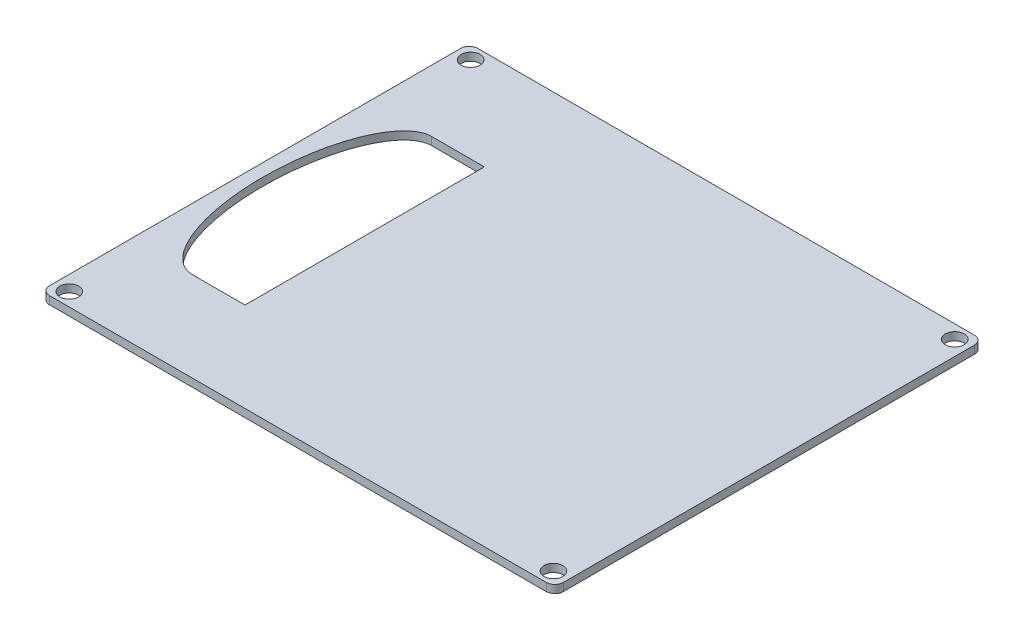
ISO-10303-21;
HEADER;
FILE_DESCRIPTION(('STEP AP214'),'2;1');
FILE_NAME('part.step','',(''),(''),'','','');
FILE_SCHEMA(('AUTOMOTIVE_DESIGN { 1 0 10303 214 1 1 1 1 }'));
ENDSEC;
DATA;
#1=APPLICATION_CONTEXT('core data for automotive mechanical design processes');
#2=APPLICATION_PROTOCOL_DEFINITION('international standard','automotive_design',2000,#1);
#3=PRODUCT_CONTEXT('',#1,'mechanical');
#4=PRODUCT('Part','Part','',(#3));
#5=PRODUCT_RELATED_PRODUCT_CATEGORY('part','',(#4));
#6=PRODUCT_DEFINITION_FORMATION('','',#4);
#7=PRODUCT_DEFINITION_CONTEXT('part definition',#1,'design');
#8=PRODUCT_DEFINITION('design','',#6,#7);
#9=PRODUCT_DEFINITION_SHAPE('','',#8);
#10=(LENGTH_UNIT() NAMED_UNIT(*) SI_UNIT(.MILLI.,.METRE.));
#11=(NAMED_UNIT(*) PLANE_ANGLE_UNIT() SI_UNIT($,.RADIAN.));
#12=(NAMED_UNIT(*) SI_UNIT($,.STERADIAN.) SOLID_ANGLE_UNIT());
#13=UNCERTAINTY_MEASURE_WITH_UNIT(LENGTH_MEASURE(1.E-05),#10,'distance_accuracy_value','');
#14=(GEOMETRIC_REPRESENTATION_CONTEXT(3) GLOBAL_UNCERTAINTY_ASSIGNED_CONTEXT((#13)) GLOBAL_UNIT_ASSIGNED_CONTEXT((#10,
#11,#12)) REPRESENTATION_CONTEXT('',''));
#15=CARTESIAN_POINT('',(0.,0.,0.));
#16=DIRECTION('',(0.,0.,1.));
#17=DIRECTION('',(1.,0.,0.));
#18=AXIS2_PLACEMENT_3D('',#15,#16,#17);
#19=CARTESIAN_POINT('',(76.2,2.3622,-63.5));
#20=DIRECTION('',(-1.,0.,0.));
#21=DIRECTION('',(0.,0.,1.));
#22=AXIS2_PLACEMENT_3D('',#19,#20,#21);
#23=PLANE('',#22);
#24=DIRECTION('',(0.,0.,-1.));
#25=VECTOR('',#24,1.);
#26=CARTESIAN_POINT('',(76.2,2.3622,-63.5));
#27=LINE('',#26,#25);
#28=CARTESIAN_POINT('',(76.2,2.3622,60.96));
#29=VERTEX_POINT('',#28);
#30=CARTESIAN_POINT('',(76.2,2.3622,-60.96));
#31=VERTEX_POINT('',#30);
#32=EDGE_CURVE('E183',#29,#31,#27,.T.);
#33=ORIENTED_EDGE('',*,*,#32,.F.);
#34=DIRECTION('',(0.,-1.,0.));
#35=VECTOR('',#34,1.);
#36=CARTESIAN_POINT('',(76.2,2.3622,60.96));
#37=LINE('',#36,#35);
#38=CARTESIAN_POINT('',(76.2,0.,60.96));
#39=VERTEX_POINT('',#38);
#40=EDGE_CURVE('E234',#29,#39,#37,.T.);
#41=ORIENTED_EDGE('',*,*,#40,.T.);
#42=DIRECTION('',(0.,0.,-1.));
#43=VECTOR('',#42,1.);
#44=CARTESIAN_POINT('',(76.2,0.,-63.5));
#45=LINE('',#44,#43);
#46=CARTESIAN_POINT('',(76.2,0.,-60.96));
#47=VERTEX_POINT('',#46);
#48=EDGE_CURVE('E180',#39,#47,#45,.T.);
#49=ORIENTED_EDGE('',*,*,#48,.T.);
#50=DIRECTION('',(0.,-1.,0.));
#51=VECTOR('',#50,1.);
#52=CARTESIAN_POINT('',(76.2,2.3622,-60.96));
#53=LINE('',#52,#51);
#54=EDGE_CURVE('E232',#47,#31,#53,.F.);
#55=ORIENTED_EDGE('',*,*,#54,.T.);
#56=EDGE_LOOP('',(#33,#41,#49,#55));
#57=FACE_BOUND('',#56,.T.);
#58=ADVANCED_FACE('F35',(#57),#23,.F.);
#59=CARTESIAN_POINT('',(-76.2,2.3622,-63.5));
#60=DIRECTION('',(0.,0.,1.));
#61=DIRECTION('',(1.,0.,0.));
#62=AXIS2_PLACEMENT_3D('',#59,#60,#61);
#63=PLANE('',#62);
#64=DIRECTION('',(-1.,0.,0.));
#65=VECTOR('',#64,1.);
#66=CARTESIAN_POINT('',(-76.2,2.3622,-63.5));
#67=LINE('',#66,#65);
#68=CARTESIAN_POINT('',(73.66,2.3622,-63.5));
#69=VERTEX_POINT('',#68);
#70=CARTESIAN_POINT('',(-73.66,2.3622,-63.5));
#71=VERTEX_POINT('',#70);
#72=EDGE_CURVE('E186',#69,#71,#67,.T.);
#73=ORIENTED_EDGE('',*,*,#72,.F.);
#74=DIRECTION('',(0.,-1.,0.));
#75=VECTOR('',#74,1.);
#76=CARTESIAN_POINT('',(73.66,2.3622,-63.5));
#77=LINE('',#76,#75);
#78=CARTESIAN_POINT('',(73.66,0.,-63.5));
#79=VERTEX_POINT('',#78);
#80=EDGE_CURVE('E12',#69,#79,#77,.T.);
#81=ORIENTED_EDGE('',*,*,#80,.T.);
#82=DIRECTION('',(-1.,0.,0.));
#83=VECTOR('',#82,1.);
#84=CARTESIAN_POINT('',(-76.2,0.,-63.5));
#85=LINE('',#84,#83);
#86=CARTESIAN_POINT('',(-73.66,0.,-63.5));
#87=VERTEX_POINT('',#86);
#88=EDGE_CURVE('E199',#79,#87,#85,.T.);
#89=ORIENTED_EDGE('',*,*,#88,.T.);
#90=DIRECTION('',(0.,-1.,0.));
#91=VECTOR('',#90,1.);
#92=CARTESIAN_POINT('',(-73.66,2.3622,-63.5));
#93=LINE('',#92,#91);
#94=EDGE_CURVE('E43',#87,#71,#93,.F.);
#95=ORIENTED_EDGE('',*,*,#94,.T.);
#96=EDGE_LOOP('',(#73,#81,#89,#95));
#97=FACE_BOUND('',#96,.T.);
#98=ADVANCED_FACE('F239',(#97),#63,.F.);
#99=CARTESIAN_POINT('',(-76.2,2.3622,-63.5));
#100=DIRECTION('',(1.,0.,0.));
#101=DIRECTION('',(0.,0.,-1.));
#102=AXIS2_PLACEMENT_3D('',#99,#100,#101);
#103=PLANE('',#102);
#104=DIRECTION('',(0.,0.,1.));
#105=VECTOR('',#104,1.);
#106=CARTESIAN_POINT('',(-76.2,0.,-63.5));
#107=LINE('',#106,#105);
#108=CARTESIAN_POINT('',(-76.2,0.,-60.96));
#109=VERTEX_POINT('',#108);
#110=CARTESIAN_POINT('',(-76.2,0.,60.96));
#111=VERTEX_POINT('',#110);
#112=EDGE_CURVE('E202',#109,#111,#107,.T.);
#113=ORIENTED_EDGE('',*,*,#112,.T.);
#114=DIRECTION('',(0.,-1.,0.));
#115=VECTOR('',#114,1.);
#116=CARTESIAN_POINT('',(-76.2,2.3622,60.96));
#117=LINE('',#116,#115);
#118=CARTESIAN_POINT('',(-76.2,2.3622,60.96));
#119=VERTEX_POINT('',#118);
#120=EDGE_CURVE('E222',#111,#119,#117,.F.);
#121=ORIENTED_EDGE('',*,*,#120,.T.);
#122=DIRECTION('',(0.,0.,1.));
#123=VECTOR('',#122,1.);
#124=CARTESIAN_POINT('',(-76.2,2.3622,-63.5));
#125=LINE('',#124,#123);
#126=CARTESIAN_POINT('',(-76.2,2.3622,-60.96));
#127=VERTEX_POINT('',#126);
#128=EDGE_CURVE('E190',#127,#119,#125,.T.);
#129=ORIENTED_EDGE('',*,*,#128,.F.);
#130=DIRECTION('',(0.,-1.,0.));
#131=VECTOR('',#130,1.);
#132=CARTESIAN_POINT('',(-76.2,2.3622,-60.96));
#133=LINE('',#132,#131);
#134=EDGE_CURVE('E219',#127,#109,#133,.T.);
#135=ORIENTED_EDGE('',*,*,#134,.T.);
#136=EDGE_LOOP('',(#113,#121,#129,#135));
#137=FACE_BOUND('',#136,.T.);
#138=ADVANCED_FACE('F250',(#137),#103,.F.);
#139=CARTESIAN_POINT('',(-76.2,2.3622,63.5));
#140=DIRECTION('',(0.,0.,-1.));
#141=DIRECTION('',(-1.,0.,0.));
#142=AXIS2_PLACEMENT_3D('',#139,#140,#141);
#143=PLANE('',#142);
#144=DIRECTION('',(1.,0.,0.));
#145=VECTOR('',#144,1.);
#146=CARTESIAN_POINT('',(-76.2,2.3622,63.5));
#147=LINE('',#146,#145);
#148=CARTESIAN_POINT('',(-73.66,2.3622,63.5));
#149=VERTEX_POINT('',#148);
#150=CARTESIAN_POINT('',(73.66,2.3622,63.5));
#151=VERTEX_POINT('',#150);
#152=EDGE_CURVE('E193',#149,#151,#147,.T.);
#153=ORIENTED_EDGE('',*,*,#152,.F.);
#154=DIRECTION('',(0.,-1.,0.));
#155=VECTOR('',#154,1.);
#156=CARTESIAN_POINT('',(-73.66,2.3622,63.5));
#157=LINE('',#156,#155);
#158=CARTESIAN_POINT('',(-73.66,0.,63.5));
#159=VERTEX_POINT('',#158);
#160=EDGE_CURVE('E208',#149,#159,#157,.T.);
#161=ORIENTED_EDGE('',*,*,#160,.T.);
#162=DIRECTION('',(1.,0.,0.));
#163=VECTOR('',#162,1.);
#164=CARTESIAN_POINT('',(-76.2,0.,63.5));
#165=LINE('',#164,#163);
#166=CARTESIAN_POINT('',(73.66,0.,63.5));
#167=VERTEX_POINT('',#166);
#168=EDGE_CURVE('E187',#159,#167,#165,.T.);
#169=ORIENTED_EDGE('',*,*,#168,.T.);
#170=DIRECTION('',(0.,-1.,0.));
#171=VECTOR('',#170,1.);
#172=CARTESIAN_POINT('',(73.66,2.3622,63.5));
#173=LINE('',#172,#171);
#174=EDGE_CURVE('E196',#167,#151,#173,.F.);
#175=ORIENTED_EDGE('',*,*,#174,.T.);
#176=EDGE_LOOP('',(#153,#161,#169,#175));
#177=FACE_BOUND('',#176,.T.);
#178=ADVANCED_FACE('F261',(#177),#143,.F.);
#179=CARTESIAN_POINT('',(0.,2.3622,0.));
#180=DIRECTION('',(0.,1.,0.));
#181=DIRECTION('',(0.,0.,1.));
#182=AXIS2_PLACEMENT_3D('',#179,#180,#181);
#183=PLANE('',#182);
#184=CARTESIAN_POINT('',(-57.8578913926201,2.3622,1.44007365035895));
#185=DIRECTION('',(0.,1.,0.));
#186=DIRECTION('',(0.,0.,1.));
#187=AXIS2_PLACEMENT_3D('',#184,#185,#186);
#188=ELLIPSE('',#187,35.4844500063675,14.605);
#189=CARTESIAN_POINT('',(-57.8578913926201,2.3622,-34.0443763560085));
#190=VERTEX_POINT('',#189);
#191=CARTESIAN_POINT('',(-57.8578913926201,2.3622,36.9245236567264));
#192=VERTEX_POINT('',#191);
#193=EDGE_CURVE('E50',#190,#192,#188,.T.);
#194=ORIENTED_EDGE('',*,*,#193,.F.);
#195=DIRECTION('',(-1.,0.,0.));
#196=VECTOR('',#195,1.);
#197=CARTESIAN_POINT('',(-57.8578913926201,2.3622,-34.0443763560085));
#198=LINE('',#197,#196);
#199=CARTESIAN_POINT('',(-42.2579164672201,2.3622,-34.0443763560085));
#200=VERTEX_POINT('',#199);
#201=EDGE_CURVE('E139',#200,#190,#198,.T.);
#202=ORIENTED_EDGE('',*,*,#201,.F.);
#203=DIRECTION('',(0.,0.,-1.));
#204=VECTOR('',#203,1.);
#205=CARTESIAN_POINT('',(-42.2579164672201,2.3622,-34.0443763560085));
#206=LINE('',#205,#204);
#207=CARTESIAN_POINT('',(-42.2579164672201,2.3622,36.9245236567264));
#208=VERTEX_POINT('',#207);
#209=EDGE_CURVE('E146',#208,#200,#206,.T.);
#210=ORIENTED_EDGE('',*,*,#209,.F.);
#211=DIRECTION('',(1.,0.,0.));
#212=VECTOR('',#211,1.);
#213=CARTESIAN_POINT('',(-57.8578913926201,2.3622,36.9245236567264));
#214=LINE('',#213,#212);
#215=EDGE_CURVE('E141',#192,#208,#214,.T.);
#216=ORIENTED_EDGE('',*,*,#215,.F.);
#217=EDGE_LOOP('',(#194,#202,#210,#216));
#218=FACE_BOUND('',#217,.T.);
#219=CARTESIAN_POINT('',(-71.7948137847569,2.3622,-59.5104358344753));
#220=DIRECTION('',(0.,-1.,0.));
#221=DIRECTION('',(0.,0.,1.));
#222=AXIS2_PLACEMENT_3D('',#219,#220,#221);
#223=CIRCLE('',#222,2.79400000031772);
#224=CARTESIAN_POINT('',(-71.7948137847569,2.3622,-56.7164358341575));
#225=VERTEX_POINT('',#224);
#226=EDGE_CURVE('E130',#225,#225,#223,.T.);
#227=ORIENTED_EDGE('',*,*,#226,.T.);
#228=EDGE_LOOP('',(#227));
#229=FACE_BOUND('',#228,.T.);
#230=CARTESIAN_POINT('',(-71.794813784757,2.3622,59.5104358344751));
#231=DIRECTION('',(0.,-1.,0.));
#232=DIRECTION('',(0.,0.,1.));
#233=AXIS2_PLACEMENT_3D('',#230,#231,#232);
#234=CIRCLE('',#233,2.79400000031772);
#235=CARTESIAN_POINT('',(-71.794813784757,2.3622,62.3044358347929));
#236=VERTEX_POINT('',#235);
#237=EDGE_CURVE('E162',#236,#236,#234,.T.);
#238=ORIENTED_EDGE('',*,*,#237,.T.);
#239=EDGE_LOOP('',(#238));
#240=FACE_BOUND('',#239,.T.);
#241=CARTESIAN_POINT('',(71.7948137847569,2.3622,-59.5104358344753));
#242=DIRECTION('',(0.,1.,0.));
#243=DIRECTION('',(0.,0.,1.));
#244=AXIS2_PLACEMENT_3D('',#241,#242,#243);
#245=CIRCLE('',#244,2.79400000031772);
#246=CARTESIAN_POINT('',(71.7948137847569,2.3622,-56.7164358341575));
#247=VERTEX_POINT('',#246);
#248=EDGE_CURVE('E168',#247,#247,#245,.T.);
#249=ORIENTED_EDGE('',*,*,#248,.F.);
#250=EDGE_LOOP('',(#249));
#251=FACE_BOUND('',#250,.T.);
#252=CARTESIAN_POINT('',(71.794813784757,2.3622,59.5104358344751));
#253=DIRECTION('',(0.,1.,0.));
#254=DIRECTION('',(0.,0.,1.));
#255=AXIS2_PLACEMENT_3D('',#252,#253,#254);
#256=CIRCLE('',#255,2.79400000031772);
#257=CARTESIAN_POINT('',(71.794813784757,2.3622,62.3044358347929));
#258=VERTEX_POINT('',#257);
#259=EDGE_CURVE('E174',#258,#258,#256,.T.);
#260=ORIENTED_EDGE('',*,*,#259,.F.);
#261=EDGE_LOOP('',(#260));
#262=FACE_BOUND('',#261,.T.);
#263=ORIENTED_EDGE('',*,*,#128,.T.);
#264=CARTESIAN_POINT('',(-73.66,2.3622,60.96));
#265=DIRECTION('',(0.,1.,0.));
#266=DIRECTION('',(0.,0.,1.));
#267=AXIS2_PLACEMENT_3D('',#264,#265,#266);
#268=CIRCLE('',#267,2.54);
#269=EDGE_CURVE('E230',#119,#149,#268,.T.);
#270=ORIENTED_EDGE('',*,*,#269,.T.);
#271=ORIENTED_EDGE('',*,*,#152,.T.);
#272=CARTESIAN_POINT('',(73.66,2.3622,60.96));
#273=DIRECTION('',(0.,1.,0.));
#274=DIRECTION('',(0.,0.,1.));
#275=AXIS2_PLACEMENT_3D('',#272,#273,#274);
#276=CIRCLE('',#275,2.54);
#277=EDGE_CURVE('E228',#151,#29,#276,.T.);
#278=ORIENTED_EDGE('',*,*,#277,.T.);
#279=ORIENTED_EDGE('',*,*,#32,.T.);
#280=CARTESIAN_POINT('',(73.66,2.3622,-60.96));
#281=DIRECTION('',(0.,1.,0.));
#282=DIRECTION('',(0.,0.,1.));
#283=AXIS2_PLACEMENT_3D('',#280,#281,#282);
#284=CIRCLE('',#283,2.54);
#285=EDGE_CURVE('E226',#31,#69,#284,.T.);
#286=ORIENTED_EDGE('',*,*,#285,.T.);
#287=ORIENTED_EDGE('',*,*,#72,.T.);
#288=CARTESIAN_POINT('',(-73.66,2.3622,-60.96));
#289=DIRECTION('',(0.,1.,0.));
#290=DIRECTION('',(0.,0.,1.));
#291=AXIS2_PLACEMENT_3D('',#288,#289,#290);
#292=CIRCLE('',#291,2.54);
#293=EDGE_CURVE('E224',#71,#127,#292,.T.);
#294=ORIENTED_EDGE('',*,*,#293,.T.);
#295=EDGE_LOOP('',(#263,#270,#271,#278,#279,#286,#287,#294));
#296=FACE_BOUND('',#295,.T.);
#297=ADVANCED_FACE('F136',(#218,#229,#240,#251,#262,#296),#183,.T.);
#298=CARTESIAN_POINT('',(0.,0.,0.));
#299=DIRECTION('',(0.,1.,0.));
#300=DIRECTION('',(0.,0.,1.));
#301=AXIS2_PLACEMENT_3D('',#298,#299,#300);
#302=PLANE('',#301);
#303=DIRECTION('',(-1.,0.,0.));
#304=VECTOR('',#303,1.);
#305=CARTESIAN_POINT('',(-57.8578913926201,0.,-34.0443763560085));
#306=LINE('',#305,#304);
#307=CARTESIAN_POINT('',(-42.2579164672201,0.,-34.0443763560085));
#308=VERTEX_POINT('',#307);
#309=CARTESIAN_POINT('',(-57.8578913926201,0.,-34.0443763560085));
#310=VERTEX_POINT('',#309);
#311=EDGE_CURVE('E158',#308,#310,#306,.T.);
#312=ORIENTED_EDGE('',*,*,#311,.T.);
#313=CARTESIAN_POINT('',(-57.8578913926201,0.,1.44007365035895));
#314=DIRECTION('',(0.,1.,0.));
#315=DIRECTION('',(0.,0.,1.));
#316=AXIS2_PLACEMENT_3D('',#313,#314,#315);
#317=ELLIPSE('',#316,35.4844500063675,14.605);
#318=CARTESIAN_POINT('',(-57.8578913926201,0.,36.9245236567264));
#319=VERTEX_POINT('',#318);
#320=EDGE_CURVE('E125',#310,#319,#317,.T.);
#321=ORIENTED_EDGE('',*,*,#320,.T.);
#322=DIRECTION('',(1.,0.,0.));
#323=VECTOR('',#322,1.);
#324=CARTESIAN_POINT('',(-57.8578913926201,0.,36.9245236567264));
#325=LINE('',#324,#323);
#326=CARTESIAN_POINT('',(-42.2579164672201,0.,36.9245236567264));
#327=VERTEX_POINT('',#326);
#328=EDGE_CURVE('E145',#319,#327,#325,.T.);
#329=ORIENTED_EDGE('',*,*,#328,.T.);
#330=DIRECTION('',(0.,0.,-1.));
#331=VECTOR('',#330,1.);
#332=CARTESIAN_POINT('',(-42.2579164672201,0.,-34.0443763560085));
#333=LINE('',#332,#331);
#334=EDGE_CURVE('E58',#327,#308,#333,.T.);
#335=ORIENTED_EDGE('',*,*,#334,.T.);
#336=EDGE_LOOP('',(#312,#321,#329,#335));
#337=FACE_BOUND('',#336,.T.);
#338=CARTESIAN_POINT('',(-71.7948137847569,0.,-59.5104358344753));
#339=DIRECTION('',(0.,-1.,0.));
#340=DIRECTION('',(0.,0.,1.));
#341=AXIS2_PLACEMENT_3D('',#338,#339,#340);
#342=CIRCLE('',#341,2.79400000031772);
#343=CARTESIAN_POINT('',(-71.7948137847569,0.,-56.7164358341575));
#344=VERTEX_POINT('',#343);
#345=EDGE_CURVE('E159',#344,#344,#342,.T.);
#346=ORIENTED_EDGE('',*,*,#345,.F.);
#347=EDGE_LOOP('',(#346));
#348=FACE_BOUND('',#347,.T.);
#349=CARTESIAN_POINT('',(-71.794813784757,0.,59.5104358344751));
#350=DIRECTION('',(0.,-1.,0.));
#351=DIRECTION('',(0.,0.,1.));
#352=AXIS2_PLACEMENT_3D('',#349,#350,#351);
#353=CIRCLE('',#352,2.79400000031772);
#354=CARTESIAN_POINT('',(-71.794813784757,0.,62.3044358347929));
#355=VERTEX_POINT('',#354);
#356=EDGE_CURVE('E165',#355,#355,#353,.T.);
#357=ORIENTED_EDGE('',*,*,#356,.F.);
#358=EDGE_LOOP('',(#357));
#359=FACE_BOUND('',#358,.T.);
#360=CARTESIAN_POINT('',(71.7948137847569,0.,-59.5104358344753));
#361=DIRECTION('',(0.,1.,0.));
#362=DIRECTION('',(0.,0.,1.));
#363=AXIS2_PLACEMENT_3D('',#360,#361,#362);
#364=CIRCLE('',#363,2.79400000031772);
#365=CARTESIAN_POINT('',(71.7948137847569,0.,-56.7164358341575));
#366=VERTEX_POINT('',#365);
#367=EDGE_CURVE('E171',#366,#366,#364,.T.);
#368=ORIENTED_EDGE('',*,*,#367,.T.);
#369=EDGE_LOOP('',(#368));
#370=FACE_BOUND('',#369,.T.);
#371=CARTESIAN_POINT('',(71.794813784757,0.,59.5104358344751));
#372=DIRECTION('',(0.,1.,0.));
#373=DIRECTION('',(0.,0.,1.));
#374=AXIS2_PLACEMENT_3D('',#371,#372,#373);
#375=CIRCLE('',#374,2.79400000031772);
#376=CARTESIAN_POINT('',(71.794813784757,0.,62.3044358347929));
#377=VERTEX_POINT('',#376);
#378=EDGE_CURVE('E177',#377,#377,#375,.T.);
#379=ORIENTED_EDGE('',*,*,#378,.T.);
#380=EDGE_LOOP('',(#379));
#381=FACE_BOUND('',#380,.T.);
#382=ORIENTED_EDGE('',*,*,#168,.F.);
#383=CARTESIAN_POINT('',(-73.66,0.,60.96));
#384=DIRECTION('',(0.,1.,0.));
#385=DIRECTION('',(0.,0.,1.));
#386=AXIS2_PLACEMENT_3D('',#383,#384,#385);
#387=CIRCLE('',#386,2.54);
#388=EDGE_CURVE('E217',#159,#111,#387,.F.);
#389=ORIENTED_EDGE('',*,*,#388,.T.);
#390=ORIENTED_EDGE('',*,*,#112,.F.);
#391=CARTESIAN_POINT('',(-73.66,0.,-60.96));
#392=DIRECTION('',(0.,1.,0.));
#393=DIRECTION('',(0.,0.,1.));
#394=AXIS2_PLACEMENT_3D('',#391,#392,#393);
#395=CIRCLE('',#394,2.54);
#396=EDGE_CURVE('E211',#109,#87,#395,.F.);
#397=ORIENTED_EDGE('',*,*,#396,.T.);
#398=ORIENTED_EDGE('',*,*,#88,.F.);
#399=CARTESIAN_POINT('',(73.66,0.,-60.96));
#400=DIRECTION('',(0.,1.,0.));
#401=DIRECTION('',(0.,0.,1.));
#402=AXIS2_PLACEMENT_3D('',#399,#400,#401);
#403=CIRCLE('',#402,2.54);
#404=EDGE_CURVE('E213',#79,#47,#403,.F.);
#405=ORIENTED_EDGE('',*,*,#404,.T.);
#406=ORIENTED_EDGE('',*,*,#48,.F.);
#407=CARTESIAN_POINT('',(73.66,0.,60.96));
#408=DIRECTION('',(0.,1.,0.));
#409=DIRECTION('',(0.,0.,1.));
#410=AXIS2_PLACEMENT_3D('',#407,#408,#409);
#411=CIRCLE('',#410,2.54);
#412=EDGE_CURVE('E215',#39,#167,#411,.F.);
#413=ORIENTED_EDGE('',*,*,#412,.T.);
#414=EDGE_LOOP('',(#382,#389,#390,#397,#398,#405,#406,#413));
#415=FACE_BOUND('',#414,.T.);
#416=ADVANCED_FACE('F254',(#337,#348,#359,#370,#381,#415),#302,.F.);
#417=CARTESIAN_POINT('',(71.794813784757,0.,59.5104358344751));
#418=DIRECTION('',(0.,1.,0.));
#419=DIRECTION('',(0.,0.,1.));
#420=AXIS2_PLACEMENT_3D('',#417,#418,#419);
#421=CYLINDRICAL_SURFACE('',#420,2.79400000031772);
#422=ORIENTED_EDGE('',*,*,#378,.F.);
#423=EDGE_LOOP('',(#422));
#424=FACE_BOUND('',#423,.T.);
#425=ORIENTED_EDGE('',*,*,#259,.T.);
#426=EDGE_LOOP('',(#425));
#427=FACE_BOUND('',#426,.T.);
#428=ADVANCED_FACE('F308',(#424,#427),#421,.F.);
#429=CARTESIAN_POINT('',(71.7948137847569,0.,-59.5104358344753));
#430=DIRECTION('',(0.,1.,0.));
#431=DIRECTION('',(0.,0.,1.));
#432=AXIS2_PLACEMENT_3D('',#429,#430,#431);
#433=CYLINDRICAL_SURFACE('',#432,2.79400000031772);
#434=ORIENTED_EDGE('',*,*,#367,.F.);
#435=EDGE_LOOP('',(#434));
#436=FACE_BOUND('',#435,.T.);
#437=ORIENTED_EDGE('',*,*,#248,.T.);
#438=EDGE_LOOP('',(#437));
#439=FACE_BOUND('',#438,.T.);
#440=ADVANCED_FACE('F298',(#436,#439),#433,.F.);
#441=CARTESIAN_POINT('',(-71.794813784757,0.,59.5104358344751));
#442=DIRECTION('',(0.,1.,0.));
#443=DIRECTION('',(0.,0.,1.));
#444=AXIS2_PLACEMENT_3D('',#441,#442,#443);
#445=CYLINDRICAL_SURFACE('',#444,2.79400000031772);
#446=ORIENTED_EDGE('',*,*,#356,.T.);
#447=EDGE_LOOP('',(#446));
#448=FACE_BOUND('',#447,.T.);
#449=ORIENTED_EDGE('',*,*,#237,.F.);
#450=EDGE_LOOP('',(#449));
#451=FACE_BOUND('',#450,.T.);
#452=ADVANCED_FACE('F292',(#448,#451),#445,.F.);
#453=CARTESIAN_POINT('',(-71.7948137847569,0.,-59.5104358344753));
#454=DIRECTION('',(0.,1.,0.));
#455=DIRECTION('',(0.,0.,1.));
#456=AXIS2_PLACEMENT_3D('',#453,#454,#455);
#457=CYLINDRICAL_SURFACE('',#456,2.79400000031772);
#458=ORIENTED_EDGE('',*,*,#345,.T.);
#459=EDGE_LOOP('',(#458));
#460=FACE_BOUND('',#459,.T.);
#461=ORIENTED_EDGE('',*,*,#226,.F.);
#462=EDGE_LOOP('',(#461));
#463=FACE_BOUND('',#462,.T.);
#464=ADVANCED_FACE('F288',(#460,#463),#457,.F.);
#465=CARTESIAN_POINT('',(-73.66,2.3622,60.96));
#466=DIRECTION('',(0.,-1.,0.));
#467=DIRECTION('',(0.,0.,-1.));
#468=AXIS2_PLACEMENT_3D('',#465,#466,#467);
#469=CYLINDRICAL_SURFACE('',#468,2.54);
#470=ORIENTED_EDGE('',*,*,#269,.F.);
#471=ORIENTED_EDGE('',*,*,#120,.F.);
#472=ORIENTED_EDGE('',*,*,#388,.F.);
#473=ORIENTED_EDGE('',*,*,#160,.F.);
#474=EDGE_LOOP('',(#470,#471,#472,#473));
#475=FACE_BOUND('',#474,.T.);
#476=ADVANCED_FACE('F258',(#475),#469,.T.);
#477=CARTESIAN_POINT('',(73.66,2.3622,60.96));
#478=DIRECTION('',(0.,-1.,0.));
#479=DIRECTION('',(0.,0.,-1.));
#480=AXIS2_PLACEMENT_3D('',#477,#478,#479);
#481=CYLINDRICAL_SURFACE('',#480,2.54);
#482=ORIENTED_EDGE('',*,*,#277,.F.);
#483=ORIENTED_EDGE('',*,*,#174,.F.);
#484=ORIENTED_EDGE('',*,*,#412,.F.);
#485=ORIENTED_EDGE('',*,*,#40,.F.);
#486=EDGE_LOOP('',(#482,#483,#484,#485));
#487=FACE_BOUND('',#486,.T.);
#488=ADVANCED_FACE('F267',(#487),#481,.T.);
#489=CARTESIAN_POINT('',(73.66,2.3622,-60.96));
#490=DIRECTION('',(0.,-1.,0.));
#491=DIRECTION('',(0.,0.,-1.));
#492=AXIS2_PLACEMENT_3D('',#489,#490,#491);
#493=CYLINDRICAL_SURFACE('',#492,2.54);
#494=ORIENTED_EDGE('',*,*,#285,.F.);
#495=ORIENTED_EDGE('',*,*,#54,.F.);
#496=ORIENTED_EDGE('',*,*,#404,.F.);
#497=ORIENTED_EDGE('',*,*,#80,.F.);
#498=EDGE_LOOP('',(#494,#495,#496,#497));
#499=FACE_BOUND('',#498,.T.);
#500=ADVANCED_FACE('F272',(#499),#493,.T.);
#501=CARTESIAN_POINT('',(-73.66,2.3622,-60.96));
#502=DIRECTION('',(0.,-1.,0.));
#503=DIRECTION('',(0.,0.,-1.));
#504=AXIS2_PLACEMENT_3D('',#501,#502,#503);
#505=CYLINDRICAL_SURFACE('',#504,2.54);
#506=ORIENTED_EDGE('',*,*,#293,.F.);
#507=ORIENTED_EDGE('',*,*,#94,.F.);
#508=ORIENTED_EDGE('',*,*,#396,.F.);
#509=ORIENTED_EDGE('',*,*,#134,.F.);
#510=EDGE_LOOP('',(#506,#507,#508,#509));
#511=FACE_BOUND('',#510,.T.);
#512=ADVANCED_FACE('F37',(#511),#505,.T.);
#513=CARTESIAN_POINT('',(-57.8578913926201,0.,-34.0443763560085));
#514=DIRECTION('',(0.,0.,-1.));
#515=DIRECTION('',(-1.,0.,0.));
#516=AXIS2_PLACEMENT_3D('',#513,#514,#515);
#517=PLANE('',#516);
#518=ORIENTED_EDGE('',*,*,#201,.T.);
#519=DIRECTION('',(0.,1.,0.));
#520=VECTOR('',#519,1.);
#521=CARTESIAN_POINT('',(-57.8578913926201,0.,-34.0443763560085));
#522=LINE('',#521,#520);
#523=EDGE_CURVE('E122',#310,#190,#522,.T.);
#524=ORIENTED_EDGE('',*,*,#523,.F.);
#525=ORIENTED_EDGE('',*,*,#311,.F.);
#526=DIRECTION('',(0.,1.,0.));
#527=VECTOR('',#526,1.);
#528=CARTESIAN_POINT('',(-42.2579164672201,0.,-34.0443763560085));
#529=LINE('',#528,#527);
#530=EDGE_CURVE('E131',#308,#200,#529,.T.);
#531=ORIENTED_EDGE('',*,*,#530,.T.);
#532=EDGE_LOOP('',(#518,#524,#525,#531));
#533=FACE_BOUND('',#532,.T.);
#534=ADVANCED_FACE('F143',(#533),#517,.F.);
#535=CARTESIAN_POINT('',(-42.2579164672201,0.,-34.0443763560085));
#536=DIRECTION('',(1.,0.,0.));
#537=DIRECTION('',(0.,0.,-1.));
#538=AXIS2_PLACEMENT_3D('',#535,#536,#537);
#539=PLANE('',#538);
#540=ORIENTED_EDGE('',*,*,#209,.T.);
#541=ORIENTED_EDGE('',*,*,#530,.F.);
#542=ORIENTED_EDGE('',*,*,#334,.F.);
#543=DIRECTION('',(0.,1.,0.));
#544=VECTOR('',#543,1.);
#545=CARTESIAN_POINT('',(-42.2579164672201,0.,36.9245236567264));
#546=LINE('',#545,#544);
#547=EDGE_CURVE('E154',#327,#208,#546,.T.);
#548=ORIENTED_EDGE('',*,*,#547,.T.);
#549=EDGE_LOOP('',(#540,#541,#542,#548));
#550=FACE_BOUND('',#549,.T.);
#551=ADVANCED_FACE('F401',(#550),#539,.F.);
#552=CARTESIAN_POINT('',(-57.8578913926201,0.,36.9245236567264));
#553=DIRECTION('',(0.,0.,1.));
#554=DIRECTION('',(1.,0.,0.));
#555=AXIS2_PLACEMENT_3D('',#552,#553,#554);
#556=PLANE('',#555);
#557=ORIENTED_EDGE('',*,*,#215,.T.);
#558=ORIENTED_EDGE('',*,*,#547,.F.);
#559=ORIENTED_EDGE('',*,*,#328,.F.);
#560=DIRECTION('',(0.,1.,0.));
#561=VECTOR('',#560,1.);
#562=CARTESIAN_POINT('',(-57.8578913926201,0.,36.9245236567264));
#563=LINE('',#562,#561);
#564=EDGE_CURVE('E156',#319,#192,#563,.T.);
#565=ORIENTED_EDGE('',*,*,#564,.T.);
#566=EDGE_LOOP('',(#557,#558,#559,#565));
#567=FACE_BOUND('',#566,.T.);
#568=ADVANCED_FACE('F303',(#567),#556,.F.);
#569=DIRECTION('',(0.,1.,0.));
#570=VECTOR('',#569,1.);
#571=SURFACE_OF_LINEAR_EXTRUSION('',#317,#570);
#572=ORIENTED_EDGE('',*,*,#523,.T.);
#573=ORIENTED_EDGE('',*,*,#193,.T.);
#574=ORIENTED_EDGE('',*,*,#564,.F.);
#575=ORIENTED_EDGE('',*,*,#320,.F.);
#576=EDGE_LOOP('',(#572,#573,#574,#575));
#577=FACE_BOUND('',#576,.T.);
#578=ADVANCED_FACE('F123',(#577),#571,.F.);
#579=CLOSED_SHELL('',(#58,#98,#138,#178,#297,#416,#428,#440,#452,#464,#476,#488,#500,#512,#534,
#551,#568,#578));
#580=MANIFOLD_SOLID_BREP('B2',#579);
#581=ADVANCED_BREP_SHAPE_REPRESENTATION('',(#18,#580),#14);
#582=SHAPE_DEFINITION_REPRESENTATION(#9,#581);
ENDSEC;
END-ISO-10303-21;
